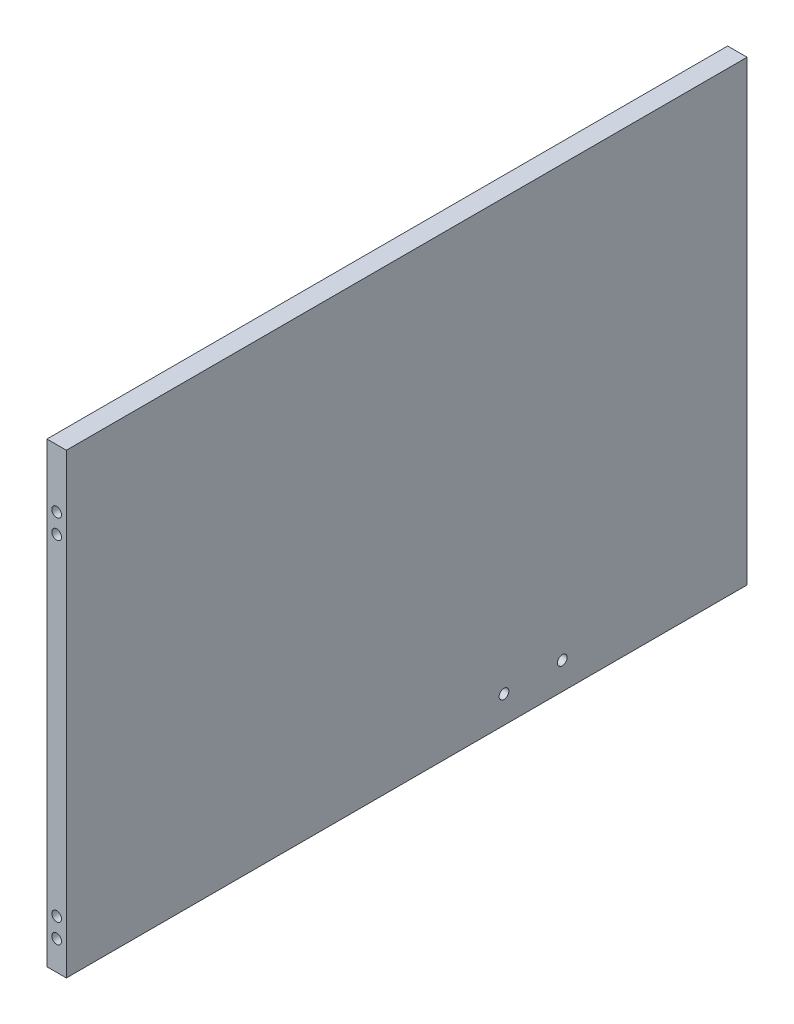
ISO-10303-21;
HEADER;
FILE_DESCRIPTION(('STEP AP214'),'2;1');
FILE_NAME('part.step','',(''),(''),'','','');
FILE_SCHEMA(('AUTOMOTIVE_DESIGN { 1 0 10303 214 1 1 1 1 }'));
ENDSEC;
DATA;
#1=APPLICATION_CONTEXT('core data for automotive mechanical design processes');
#2=APPLICATION_PROTOCOL_DEFINITION('international standard','automotive_design',2000,#1);
#3=PRODUCT_CONTEXT('',#1,'mechanical');
#4=PRODUCT('Part','Part','',(#3));
#5=PRODUCT_RELATED_PRODUCT_CATEGORY('part','',(#4));
#6=PRODUCT_DEFINITION_FORMATION('','',#4);
#7=PRODUCT_DEFINITION_CONTEXT('part definition',#1,'design');
#8=PRODUCT_DEFINITION('design','',#6,#7);
#9=PRODUCT_DEFINITION_SHAPE('','',#8);
#10=(LENGTH_UNIT() NAMED_UNIT(*) SI_UNIT(.MILLI.,.METRE.));
#11=(NAMED_UNIT(*) PLANE_ANGLE_UNIT() SI_UNIT($,.RADIAN.));
#12=(NAMED_UNIT(*) SI_UNIT($,.STERADIAN.) SOLID_ANGLE_UNIT());
#13=UNCERTAINTY_MEASURE_WITH_UNIT(LENGTH_MEASURE(1.E-05),#10,'distance_accuracy_value','');
#14=(GEOMETRIC_REPRESENTATION_CONTEXT(3) GLOBAL_UNCERTAINTY_ASSIGNED_CONTEXT((#13)) GLOBAL_UNIT_ASSIGNED_CONTEXT((#10,
#11,#12)) REPRESENTATION_CONTEXT('',''));
#15=CARTESIAN_POINT('',(0.,0.,0.));
#16=DIRECTION('',(0.,0.,1.));
#17=DIRECTION('',(1.,0.,0.));
#18=AXIS2_PLACEMENT_3D('',#15,#16,#17);
#19=CARTESIAN_POINT('',(10.,117.5,-175.));
#20=DIRECTION('',(0.,0.,1.));
#21=DIRECTION('',(0.,-1.,0.));
#22=AXIS2_PLACEMENT_3D('',#19,#20,#21);
#23=PLANE('',#22);
#24=CARTESIAN_POINT('',(5.,87.5,-175.));
#25=DIRECTION('',(0.,0.,-1.));
#26=DIRECTION('',(0.,1.,0.));
#27=AXIS2_PLACEMENT_3D('',#24,#25,#26);
#28=CIRCLE('',#27,2.5);
#29=CARTESIAN_POINT('',(5.,90.,-175.));
#30=VERTEX_POINT('',#29);
#31=EDGE_CURVE('E144',#30,#30,#28,.T.);
#32=ORIENTED_EDGE('',*,*,#31,.F.);
#33=EDGE_LOOP('',(#32));
#34=FACE_BOUND('',#33,.T.);
#35=CARTESIAN_POINT('',(5.,77.5,-175.));
#36=DIRECTION('',(0.,0.,-1.));
#37=DIRECTION('',(0.,1.,0.));
#38=AXIS2_PLACEMENT_3D('',#35,#36,#37);
#39=CIRCLE('',#38,2.5);
#40=CARTESIAN_POINT('',(5.,80.,-175.));
#41=VERTEX_POINT('',#40);
#42=EDGE_CURVE('E138',#41,#41,#39,.T.);
#43=ORIENTED_EDGE('',*,*,#42,.F.);
#44=EDGE_LOOP('',(#43));
#45=FACE_BOUND('',#44,.T.);
#46=CARTESIAN_POINT('',(5.,-92.5,-175.));
#47=DIRECTION('',(0.,0.,-1.));
#48=DIRECTION('',(0.,1.,0.));
#49=AXIS2_PLACEMENT_3D('',#46,#47,#48);
#50=CIRCLE('',#49,2.5);
#51=CARTESIAN_POINT('',(5.,-90.,-175.));
#52=VERTEX_POINT('',#51);
#53=EDGE_CURVE('E132',#52,#52,#50,.T.);
#54=ORIENTED_EDGE('',*,*,#53,.F.);
#55=EDGE_LOOP('',(#54));
#56=FACE_BOUND('',#55,.T.);
#57=CARTESIAN_POINT('',(5.,-102.5,-175.));
#58=DIRECTION('',(0.,0.,-1.));
#59=DIRECTION('',(0.,1.,0.));
#60=AXIS2_PLACEMENT_3D('',#57,#58,#59);
#61=CIRCLE('',#60,2.5);
#62=CARTESIAN_POINT('',(5.,-100.,-175.));
#63=VERTEX_POINT('',#62);
#64=EDGE_CURVE('E125',#63,#63,#61,.T.);
#65=ORIENTED_EDGE('',*,*,#64,.F.);
#66=EDGE_LOOP('',(#65));
#67=FACE_BOUND('',#66,.T.);
#68=DIRECTION('',(0.,1.,0.));
#69=VECTOR('',#68,1.);
#70=CARTESIAN_POINT('',(0.,117.5,-175.));
#71=LINE('',#70,#69);
#72=CARTESIAN_POINT('',(0.,-117.5,-175.));
#73=VERTEX_POINT('',#72);
#74=CARTESIAN_POINT('',(0.,117.5,-175.));
#75=VERTEX_POINT('',#74);
#76=EDGE_CURVE('E99',#73,#75,#71,.T.);
#77=ORIENTED_EDGE('',*,*,#76,.T.);
#78=DIRECTION('',(-1.,0.,0.));
#79=VECTOR('',#78,1.);
#80=CARTESIAN_POINT('',(10.,117.5,-175.));
#81=LINE('',#80,#79);
#82=CARTESIAN_POINT('',(10.,117.5,-175.));
#83=VERTEX_POINT('',#82);
#84=EDGE_CURVE('E11',#83,#75,#81,.T.);
#85=ORIENTED_EDGE('',*,*,#84,.F.);
#86=DIRECTION('',(0.,1.,0.));
#87=VECTOR('',#86,1.);
#88=CARTESIAN_POINT('',(10.,117.5,-175.));
#89=LINE('',#88,#87);
#90=CARTESIAN_POINT('',(10.,-117.5,-175.));
#91=VERTEX_POINT('',#90);
#92=EDGE_CURVE('E87',#91,#83,#89,.T.);
#93=ORIENTED_EDGE('',*,*,#92,.F.);
#94=DIRECTION('',(-1.,0.,0.));
#95=VECTOR('',#94,1.);
#96=CARTESIAN_POINT('',(10.,-117.5,-175.));
#97=LINE('',#96,#95);
#98=EDGE_CURVE('E95',#91,#73,#97,.T.);
#99=ORIENTED_EDGE('',*,*,#98,.T.);
#100=EDGE_LOOP('',(#77,#85,#93,#99));
#101=FACE_BOUND('',#100,.T.);
#102=ADVANCED_FACE('F36',(#34,#45,#56,#67,#101),#23,.F.);
#103=CARTESIAN_POINT('',(10.,117.5,175.));
#104=DIRECTION('',(0.,-1.,0.));
#105=DIRECTION('',(0.,0.,-1.));
#106=AXIS2_PLACEMENT_3D('',#103,#104,#105);
#107=PLANE('',#106);
#108=DIRECTION('',(0.,0.,1.));
#109=VECTOR('',#108,1.);
#110=CARTESIAN_POINT('',(0.,117.5,175.));
#111=LINE('',#110,#109);
#112=CARTESIAN_POINT('',(0.,117.5,175.));
#113=VERTEX_POINT('',#112);
#114=EDGE_CURVE('E91',#75,#113,#111,.T.);
#115=ORIENTED_EDGE('',*,*,#114,.T.);
#116=DIRECTION('',(-1.,0.,0.));
#117=VECTOR('',#116,1.);
#118=CARTESIAN_POINT('',(10.,117.5,175.));
#119=LINE('',#118,#117);
#120=CARTESIAN_POINT('',(10.,117.5,175.));
#121=VERTEX_POINT('',#120);
#122=EDGE_CURVE('E44',#121,#113,#119,.T.);
#123=ORIENTED_EDGE('',*,*,#122,.F.);
#124=DIRECTION('',(0.,0.,1.));
#125=VECTOR('',#124,1.);
#126=CARTESIAN_POINT('',(10.,117.5,175.));
#127=LINE('',#126,#125);
#128=EDGE_CURVE('E82',#83,#121,#127,.T.);
#129=ORIENTED_EDGE('',*,*,#128,.F.);
#130=ORIENTED_EDGE('',*,*,#84,.T.);
#131=EDGE_LOOP('',(#115,#123,#129,#130));
#132=FACE_BOUND('',#131,.T.);
#133=ADVANCED_FACE('F90',(#132),#107,.F.);
#134=CARTESIAN_POINT('',(10.,117.5,175.));
#135=DIRECTION('',(0.,0.,-1.));
#136=DIRECTION('',(0.,1.,0.));
#137=AXIS2_PLACEMENT_3D('',#134,#135,#136);
#138=PLANE('',#137);
#139=CARTESIAN_POINT('',(5.,87.5,175.));
#140=DIRECTION('',(0.,0.,-1.));
#141=DIRECTION('',(0.,1.,0.));
#142=AXIS2_PLACEMENT_3D('',#139,#140,#141);
#143=CIRCLE('',#142,2.5);
#144=CARTESIAN_POINT('',(5.,90.,175.));
#145=VERTEX_POINT('',#144);
#146=EDGE_CURVE('E167',#145,#145,#143,.T.);
#147=ORIENTED_EDGE('',*,*,#146,.T.);
#148=EDGE_LOOP('',(#147));
#149=FACE_BOUND('',#148,.T.);
#150=CARTESIAN_POINT('',(5.,77.5,175.));
#151=DIRECTION('',(0.,0.,-1.));
#152=DIRECTION('',(0.,1.,0.));
#153=AXIS2_PLACEMENT_3D('',#150,#151,#152);
#154=CIRCLE('',#153,2.5);
#155=CARTESIAN_POINT('',(5.,80.,175.));
#156=VERTEX_POINT('',#155);
#157=EDGE_CURVE('E161',#156,#156,#154,.T.);
#158=ORIENTED_EDGE('',*,*,#157,.T.);
#159=EDGE_LOOP('',(#158));
#160=FACE_BOUND('',#159,.T.);
#161=CARTESIAN_POINT('',(5.,-92.5,175.));
#162=DIRECTION('',(0.,0.,-1.));
#163=DIRECTION('',(0.,1.,0.));
#164=AXIS2_PLACEMENT_3D('',#161,#162,#163);
#165=CIRCLE('',#164,2.5);
#166=CARTESIAN_POINT('',(5.,-90.,175.));
#167=VERTEX_POINT('',#166);
#168=EDGE_CURVE('E155',#167,#167,#165,.T.);
#169=ORIENTED_EDGE('',*,*,#168,.T.);
#170=EDGE_LOOP('',(#169));
#171=FACE_BOUND('',#170,.T.);
#172=CARTESIAN_POINT('',(5.,-102.5,175.));
#173=DIRECTION('',(0.,0.,-1.));
#174=DIRECTION('',(0.,1.,0.));
#175=AXIS2_PLACEMENT_3D('',#172,#173,#174);
#176=CIRCLE('',#175,2.5);
#177=CARTESIAN_POINT('',(5.,-100.,175.));
#178=VERTEX_POINT('',#177);
#179=EDGE_CURVE('E149',#178,#178,#176,.T.);
#180=ORIENTED_EDGE('',*,*,#179,.T.);
#181=EDGE_LOOP('',(#180));
#182=FACE_BOUND('',#181,.T.);
#183=DIRECTION('',(0.,-1.,0.));
#184=VECTOR('',#183,1.);
#185=CARTESIAN_POINT('',(0.,117.5,175.));
#186=LINE('',#185,#184);
#187=CARTESIAN_POINT('',(0.,-117.5,175.));
#188=VERTEX_POINT('',#187);
#189=EDGE_CURVE('E69',#113,#188,#186,.T.);
#190=ORIENTED_EDGE('',*,*,#189,.T.);
#191=DIRECTION('',(-1.,0.,0.));
#192=VECTOR('',#191,1.);
#193=CARTESIAN_POINT('',(10.,-117.5,175.));
#194=LINE('',#193,#192);
#195=CARTESIAN_POINT('',(10.,-117.5,175.));
#196=VERTEX_POINT('',#195);
#197=EDGE_CURVE('E92',#196,#188,#194,.T.);
#198=ORIENTED_EDGE('',*,*,#197,.F.);
#199=DIRECTION('',(0.,-1.,0.));
#200=VECTOR('',#199,1.);
#201=CARTESIAN_POINT('',(10.,117.5,175.));
#202=LINE('',#201,#200);
#203=EDGE_CURVE('E85',#121,#196,#202,.T.);
#204=ORIENTED_EDGE('',*,*,#203,.F.);
#205=ORIENTED_EDGE('',*,*,#122,.T.);
#206=EDGE_LOOP('',(#190,#198,#204,#205));
#207=FACE_BOUND('',#206,.T.);
#208=ADVANCED_FACE('F93',(#149,#160,#171,#182,#207),#138,.F.);
#209=CARTESIAN_POINT('',(10.,-117.5,175.));
#210=DIRECTION('',(0.,1.,0.));
#211=DIRECTION('',(0.,0.,1.));
#212=AXIS2_PLACEMENT_3D('',#209,#210,#211);
#213=PLANE('',#212);
#214=DIRECTION('',(0.,0.,-1.));
#215=VECTOR('',#214,1.);
#216=CARTESIAN_POINT('',(0.,-117.5,175.));
#217=LINE('',#216,#215);
#218=EDGE_CURVE('E75',#188,#73,#217,.T.);
#219=ORIENTED_EDGE('',*,*,#218,.T.);
#220=ORIENTED_EDGE('',*,*,#98,.F.);
#221=DIRECTION('',(0.,0.,-1.));
#222=VECTOR('',#221,1.);
#223=CARTESIAN_POINT('',(10.,-117.5,175.));
#224=LINE('',#223,#222);
#225=EDGE_CURVE('E52',#196,#91,#224,.T.);
#226=ORIENTED_EDGE('',*,*,#225,.F.);
#227=ORIENTED_EDGE('',*,*,#197,.T.);
#228=EDGE_LOOP('',(#219,#220,#226,#227));
#229=FACE_BOUND('',#228,.T.);
#230=ADVANCED_FACE('F107',(#229),#213,.F.);
#231=CARTESIAN_POINT('',(10.,0.,0.));
#232=DIRECTION('',(1.,0.,0.));
#233=DIRECTION('',(0.,0.,-1.));
#234=AXIS2_PLACEMENT_3D('',#231,#232,#233);
#235=PLANE('',#234);
#236=CARTESIAN_POINT('',(10.,-103.5,-50.0000000000001));
#237=DIRECTION('',(1.,0.,0.));
#238=DIRECTION('',(0.,0.,-1.));
#239=AXIS2_PLACEMENT_3D('',#236,#237,#238);
#240=CIRCLE('',#239,2.5);
#241=CARTESIAN_POINT('',(10.,-103.5,-52.5000000000001));
#242=VERTEX_POINT('',#241);
#243=EDGE_CURVE('E120',#242,#242,#240,.T.);
#244=ORIENTED_EDGE('',*,*,#243,.F.);
#245=EDGE_LOOP('',(#244));
#246=FACE_BOUND('',#245,.T.);
#247=CARTESIAN_POINT('',(10.,-103.5,-80.0000000000001));
#248=DIRECTION('',(1.,0.,0.));
#249=DIRECTION('',(0.,0.,-1.));
#250=AXIS2_PLACEMENT_3D('',#247,#248,#249);
#251=CIRCLE('',#250,2.5);
#252=CARTESIAN_POINT('',(10.,-103.5,-82.5000000000001));
#253=VERTEX_POINT('',#252);
#254=EDGE_CURVE('E113',#253,#253,#251,.T.);
#255=ORIENTED_EDGE('',*,*,#254,.F.);
#256=EDGE_LOOP('',(#255));
#257=FACE_BOUND('',#256,.T.);
#258=ORIENTED_EDGE('',*,*,#92,.T.);
#259=ORIENTED_EDGE('',*,*,#128,.T.);
#260=ORIENTED_EDGE('',*,*,#203,.T.);
#261=ORIENTED_EDGE('',*,*,#225,.T.);
#262=EDGE_LOOP('',(#258,#259,#260,#261));
#263=FACE_BOUND('',#262,.T.);
#264=ADVANCED_FACE('F83',(#246,#257,#263),#235,.T.);
#265=CARTESIAN_POINT('',(0.,0.,0.));
#266=DIRECTION('',(1.,0.,0.));
#267=DIRECTION('',(0.,0.,-1.));
#268=AXIS2_PLACEMENT_3D('',#265,#266,#267);
#269=PLANE('',#268);
#270=CARTESIAN_POINT('',(0.,-103.5,-50.0000000000001));
#271=DIRECTION('',(1.,0.,0.));
#272=DIRECTION('',(0.,0.,-1.));
#273=AXIS2_PLACEMENT_3D('',#270,#271,#272);
#274=CIRCLE('',#273,2.5);
#275=CARTESIAN_POINT('',(0.,-103.5,-52.5000000000001));
#276=VERTEX_POINT('',#275);
#277=EDGE_CURVE('E102',#276,#276,#274,.T.);
#278=ORIENTED_EDGE('',*,*,#277,.T.);
#279=EDGE_LOOP('',(#278));
#280=FACE_BOUND('',#279,.T.);
#281=CARTESIAN_POINT('',(0.,-103.5,-80.0000000000001));
#282=DIRECTION('',(1.,0.,0.));
#283=DIRECTION('',(0.,0.,-1.));
#284=AXIS2_PLACEMENT_3D('',#281,#282,#283);
#285=CIRCLE('',#284,2.5);
#286=CARTESIAN_POINT('',(0.,-103.5,-82.5000000000001));
#287=VERTEX_POINT('',#286);
#288=EDGE_CURVE('E116',#287,#287,#285,.T.);
#289=ORIENTED_EDGE('',*,*,#288,.T.);
#290=EDGE_LOOP('',(#289));
#291=FACE_BOUND('',#290,.T.);
#292=ORIENTED_EDGE('',*,*,#76,.F.);
#293=ORIENTED_EDGE('',*,*,#218,.F.);
#294=ORIENTED_EDGE('',*,*,#189,.F.);
#295=ORIENTED_EDGE('',*,*,#114,.F.);
#296=EDGE_LOOP('',(#292,#293,#294,#295));
#297=FACE_BOUND('',#296,.T.);
#298=ADVANCED_FACE('F110',(#280,#291,#297),#269,.F.);
#299=CARTESIAN_POINT('',(0.,-103.5,-80.0000000000001));
#300=DIRECTION('',(1.,0.,0.));
#301=DIRECTION('',(0.,0.,-1.));
#302=AXIS2_PLACEMENT_3D('',#299,#300,#301);
#303=CYLINDRICAL_SURFACE('',#302,2.5);
#304=ORIENTED_EDGE('',*,*,#288,.F.);
#305=EDGE_LOOP('',(#304));
#306=FACE_BOUND('',#305,.T.);
#307=ORIENTED_EDGE('',*,*,#254,.T.);
#308=EDGE_LOOP('',(#307));
#309=FACE_BOUND('',#308,.T.);
#310=ADVANCED_FACE('F210',(#306,#309),#303,.F.);
#311=CARTESIAN_POINT('',(0.,-103.5,-50.0000000000001));
#312=DIRECTION('',(1.,0.,0.));
#313=DIRECTION('',(0.,0.,-1.));
#314=AXIS2_PLACEMENT_3D('',#311,#312,#313);
#315=CYLINDRICAL_SURFACE('',#314,2.5);
#316=ORIENTED_EDGE('',*,*,#277,.F.);
#317=EDGE_LOOP('',(#316));
#318=FACE_BOUND('',#317,.T.);
#319=ORIENTED_EDGE('',*,*,#243,.T.);
#320=EDGE_LOOP('',(#319));
#321=FACE_BOUND('',#320,.T.);
#322=ADVANCED_FACE('F200',(#318,#321),#315,.F.);
#323=CARTESIAN_POINT('',(5.,-102.5,-165.));
#324=DIRECTION('',(0.,0.,-1.));
#325=DIRECTION('',(0.,1.,0.));
#326=AXIS2_PLACEMENT_3D('',#323,#324,#325);
#327=CYLINDRICAL_SURFACE('',#326,2.5);
#328=CARTESIAN_POINT('',(5.,-102.5,-165.));
#329=DIRECTION('',(0.,0.,-1.));
#330=DIRECTION('',(0.,1.,0.));
#331=AXIS2_PLACEMENT_3D('',#328,#329,#330);
#332=CIRCLE('',#331,2.5);
#333=CARTESIAN_POINT('',(5.,-100.,-165.));
#334=VERTEX_POINT('',#333);
#335=EDGE_CURVE('E128',#334,#334,#332,.T.);
#336=ORIENTED_EDGE('',*,*,#335,.F.);
#337=EDGE_LOOP('',(#336));
#338=FACE_BOUND('',#337,.T.);
#339=ORIENTED_EDGE('',*,*,#64,.T.);
#340=EDGE_LOOP('',(#339));
#341=FACE_BOUND('',#340,.T.);
#342=ADVANCED_FACE('F197',(#338,#341),#327,.F.);
#343=CARTESIAN_POINT('',(5.,-102.5,-165.));
#344=DIRECTION('',(0.,0.,-1.));
#345=DIRECTION('',(0.,1.,0.));
#346=AXIS2_PLACEMENT_3D('',#343,#344,#345);
#347=PLANE('',#346);
#348=ORIENTED_EDGE('',*,*,#335,.T.);
#349=EDGE_LOOP('',(#348));
#350=FACE_BOUND('',#349,.T.);
#351=ADVANCED_FACE('F199',(#350),#347,.T.);
#352=CARTESIAN_POINT('',(5.,-92.5,-165.));
#353=DIRECTION('',(0.,0.,-1.));
#354=DIRECTION('',(0.,1.,0.));
#355=AXIS2_PLACEMENT_3D('',#352,#353,#354);
#356=CYLINDRICAL_SURFACE('',#355,2.5);
#357=CARTESIAN_POINT('',(5.,-92.5,-165.));
#358=DIRECTION('',(0.,0.,-1.));
#359=DIRECTION('',(0.,1.,0.));
#360=AXIS2_PLACEMENT_3D('',#357,#358,#359);
#361=CIRCLE('',#360,2.5);
#362=CARTESIAN_POINT('',(5.,-90.,-165.));
#363=VERTEX_POINT('',#362);
#364=EDGE_CURVE('E135',#363,#363,#361,.T.);
#365=ORIENTED_EDGE('',*,*,#364,.F.);
#366=EDGE_LOOP('',(#365));
#367=FACE_BOUND('',#366,.T.);
#368=ORIENTED_EDGE('',*,*,#53,.T.);
#369=EDGE_LOOP('',(#368));
#370=FACE_BOUND('',#369,.T.);
#371=ADVANCED_FACE('F207',(#367,#370),#356,.F.);
#372=CARTESIAN_POINT('',(5.,-92.5,-165.));
#373=DIRECTION('',(0.,0.,-1.));
#374=DIRECTION('',(0.,1.,0.));
#375=AXIS2_PLACEMENT_3D('',#372,#373,#374);
#376=PLANE('',#375);
#377=ORIENTED_EDGE('',*,*,#364,.T.);
#378=EDGE_LOOP('',(#377));
#379=FACE_BOUND('',#378,.T.);
#380=ADVANCED_FACE('F267',(#379),#376,.T.);
#381=CARTESIAN_POINT('',(5.,77.5,-165.));
#382=DIRECTION('',(0.,0.,-1.));
#383=DIRECTION('',(0.,1.,0.));
#384=AXIS2_PLACEMENT_3D('',#381,#382,#383);
#385=CYLINDRICAL_SURFACE('',#384,2.5);
#386=CARTESIAN_POINT('',(5.,77.5,-165.));
#387=DIRECTION('',(0.,0.,-1.));
#388=DIRECTION('',(0.,1.,0.));
#389=AXIS2_PLACEMENT_3D('',#386,#387,#388);
#390=CIRCLE('',#389,2.5);
#391=CARTESIAN_POINT('',(5.,80.,-165.));
#392=VERTEX_POINT('',#391);
#393=EDGE_CURVE('E141',#392,#392,#390,.T.);
#394=ORIENTED_EDGE('',*,*,#393,.F.);
#395=EDGE_LOOP('',(#394));
#396=FACE_BOUND('',#395,.T.);
#397=ORIENTED_EDGE('',*,*,#42,.T.);
#398=EDGE_LOOP('',(#397));
#399=FACE_BOUND('',#398,.T.);
#400=ADVANCED_FACE('F263',(#396,#399),#385,.F.);
#401=CARTESIAN_POINT('',(5.,77.5,-165.));
#402=DIRECTION('',(0.,0.,-1.));
#403=DIRECTION('',(0.,1.,0.));
#404=AXIS2_PLACEMENT_3D('',#401,#402,#403);
#405=PLANE('',#404);
#406=ORIENTED_EDGE('',*,*,#393,.T.);
#407=EDGE_LOOP('',(#406));
#408=FACE_BOUND('',#407,.T.);
#409=ADVANCED_FACE('F259',(#408),#405,.T.);
#410=CARTESIAN_POINT('',(5.,87.5,-165.));
#411=DIRECTION('',(0.,0.,-1.));
#412=DIRECTION('',(0.,1.,0.));
#413=AXIS2_PLACEMENT_3D('',#410,#411,#412);
#414=CYLINDRICAL_SURFACE('',#413,2.5);
#415=CARTESIAN_POINT('',(5.,87.5,-165.));
#416=DIRECTION('',(0.,0.,-1.));
#417=DIRECTION('',(0.,1.,0.));
#418=AXIS2_PLACEMENT_3D('',#415,#416,#417);
#419=CIRCLE('',#418,2.5);
#420=CARTESIAN_POINT('',(5.,90.,-165.));
#421=VERTEX_POINT('',#420);
#422=EDGE_CURVE('E117',#421,#421,#419,.T.);
#423=ORIENTED_EDGE('',*,*,#422,.F.);
#424=EDGE_LOOP('',(#423));
#425=FACE_BOUND('',#424,.T.);
#426=ORIENTED_EDGE('',*,*,#31,.T.);
#427=EDGE_LOOP('',(#426));
#428=FACE_BOUND('',#427,.T.);
#429=ADVANCED_FACE('F252',(#425,#428),#414,.F.);
#430=CARTESIAN_POINT('',(5.,87.5,-165.));
#431=DIRECTION('',(0.,0.,-1.));
#432=DIRECTION('',(0.,1.,0.));
#433=AXIS2_PLACEMENT_3D('',#430,#431,#432);
#434=PLANE('',#433);
#435=ORIENTED_EDGE('',*,*,#422,.T.);
#436=EDGE_LOOP('',(#435));
#437=FACE_BOUND('',#436,.T.);
#438=ADVANCED_FACE('F242',(#437),#434,.T.);
#439=CARTESIAN_POINT('',(5.,-102.5,165.));
#440=DIRECTION('',(0.,0.,1.));
#441=DIRECTION('',(0.,-1.,0.));
#442=AXIS2_PLACEMENT_3D('',#439,#440,#441);
#443=CYLINDRICAL_SURFACE('',#442,2.5);
#444=CARTESIAN_POINT('',(5.,-102.5,165.));
#445=DIRECTION('',(0.,0.,-1.));
#446=DIRECTION('',(0.,1.,0.));
#447=AXIS2_PLACEMENT_3D('',#444,#445,#446);
#448=CIRCLE('',#447,2.5);
#449=CARTESIAN_POINT('',(5.,-100.,165.));
#450=VERTEX_POINT('',#449);
#451=EDGE_CURVE('E152',#450,#450,#448,.T.);
#452=ORIENTED_EDGE('',*,*,#451,.T.);
#453=EDGE_LOOP('',(#452));
#454=FACE_BOUND('',#453,.T.);
#455=ORIENTED_EDGE('',*,*,#179,.F.);
#456=EDGE_LOOP('',(#455));
#457=FACE_BOUND('',#456,.T.);
#458=ADVANCED_FACE('F239',(#454,#457),#443,.F.);
#459=CARTESIAN_POINT('',(5.,-102.5,165.));
#460=DIRECTION('',(0.,0.,1.));
#461=DIRECTION('',(0.,1.,0.));
#462=AXIS2_PLACEMENT_3D('',#459,#460,#461);
#463=PLANE('',#462);
#464=ORIENTED_EDGE('',*,*,#451,.F.);
#465=EDGE_LOOP('',(#464));
#466=FACE_BOUND('',#465,.T.);
#467=ADVANCED_FACE('F241',(#466),#463,.T.);
#468=CARTESIAN_POINT('',(5.,-92.5,165.));
#469=DIRECTION('',(0.,0.,1.));
#470=DIRECTION('',(0.,-1.,0.));
#471=AXIS2_PLACEMENT_3D('',#468,#469,#470);
#472=CYLINDRICAL_SURFACE('',#471,2.5);
#473=CARTESIAN_POINT('',(5.,-92.5,165.));
#474=DIRECTION('',(0.,0.,-1.));
#475=DIRECTION('',(0.,1.,0.));
#476=AXIS2_PLACEMENT_3D('',#473,#474,#475);
#477=CIRCLE('',#476,2.5);
#478=CARTESIAN_POINT('',(5.,-90.,165.));
#479=VERTEX_POINT('',#478);
#480=EDGE_CURVE('E158',#479,#479,#477,.T.);
#481=ORIENTED_EDGE('',*,*,#480,.T.);
#482=EDGE_LOOP('',(#481));
#483=FACE_BOUND('',#482,.T.);
#484=ORIENTED_EDGE('',*,*,#168,.F.);
#485=EDGE_LOOP('',(#484));
#486=FACE_BOUND('',#485,.T.);
#487=ADVANCED_FACE('F249',(#483,#486),#472,.F.);
#488=CARTESIAN_POINT('',(5.,-92.5,165.));
#489=DIRECTION('',(0.,0.,1.));
#490=DIRECTION('',(0.,1.,0.));
#491=AXIS2_PLACEMENT_3D('',#488,#489,#490);
#492=PLANE('',#491);
#493=ORIENTED_EDGE('',*,*,#480,.F.);
#494=EDGE_LOOP('',(#493));
#495=FACE_BOUND('',#494,.T.);
#496=ADVANCED_FACE('F324',(#495),#492,.T.);
#497=CARTESIAN_POINT('',(5.,77.5,165.));
#498=DIRECTION('',(0.,0.,1.));
#499=DIRECTION('',(0.,-1.,0.));
#500=AXIS2_PLACEMENT_3D('',#497,#498,#499);
#501=CYLINDRICAL_SURFACE('',#500,2.5);
#502=CARTESIAN_POINT('',(5.,77.5,165.));
#503=DIRECTION('',(0.,0.,-1.));
#504=DIRECTION('',(0.,1.,0.));
#505=AXIS2_PLACEMENT_3D('',#502,#503,#504);
#506=CIRCLE('',#505,2.5);
#507=CARTESIAN_POINT('',(5.,80.,165.));
#508=VERTEX_POINT('',#507);
#509=EDGE_CURVE('E164',#508,#508,#506,.T.);
#510=ORIENTED_EDGE('',*,*,#509,.T.);
#511=EDGE_LOOP('',(#510));
#512=FACE_BOUND('',#511,.T.);
#513=ORIENTED_EDGE('',*,*,#157,.F.);
#514=EDGE_LOOP('',(#513));
#515=FACE_BOUND('',#514,.T.);
#516=ADVANCED_FACE('F333',(#512,#515),#501,.F.);
#517=CARTESIAN_POINT('',(5.,77.5,165.));
#518=DIRECTION('',(0.,0.,1.));
#519=DIRECTION('',(0.,1.,0.));
#520=AXIS2_PLACEMENT_3D('',#517,#518,#519);
#521=PLANE('',#520);
#522=ORIENTED_EDGE('',*,*,#509,.F.);
#523=EDGE_LOOP('',(#522));
#524=FACE_BOUND('',#523,.T.);
#525=ADVANCED_FACE('F182',(#524),#521,.T.);
#526=CARTESIAN_POINT('',(5.,87.5,165.));
#527=DIRECTION('',(0.,0.,1.));
#528=DIRECTION('',(0.,-1.,0.));
#529=AXIS2_PLACEMENT_3D('',#526,#527,#528);
#530=CYLINDRICAL_SURFACE('',#529,2.5);
#531=CARTESIAN_POINT('',(5.,87.5,165.));
#532=DIRECTION('',(0.,0.,-1.));
#533=DIRECTION('',(0.,1.,0.));
#534=AXIS2_PLACEMENT_3D('',#531,#532,#533);
#535=CIRCLE('',#534,2.5);
#536=CARTESIAN_POINT('',(5.,90.,165.));
#537=VERTEX_POINT('',#536);
#538=EDGE_CURVE('E129',#537,#537,#535,.T.);
#539=ORIENTED_EDGE('',*,*,#538,.T.);
#540=EDGE_LOOP('',(#539));
#541=FACE_BOUND('',#540,.T.);
#542=ORIENTED_EDGE('',*,*,#146,.F.);
#543=EDGE_LOOP('',(#542));
#544=FACE_BOUND('',#543,.T.);
#545=ADVANCED_FACE('F173',(#541,#544),#530,.F.);
#546=CARTESIAN_POINT('',(5.,87.5,165.));
#547=DIRECTION('',(0.,0.,1.));
#548=DIRECTION('',(0.,1.,0.));
#549=AXIS2_PLACEMENT_3D('',#546,#547,#548);
#550=PLANE('',#549);
#551=ORIENTED_EDGE('',*,*,#538,.F.);
#552=EDGE_LOOP('',(#551));
#553=FACE_BOUND('',#552,.T.);
#554=ADVANCED_FACE('F176',(#553),#550,.T.);
#555=CLOSED_SHELL('',(#102,#133,#208,#230,#264,#298,#310,#322,#342,#351,#371,#380,#400,#409,
#429,#438,#458,#467,#487,#496,#516,#525,#545,#554));
#556=MANIFOLD_SOLID_BREP('B2',#555);
#557=ADVANCED_BREP_SHAPE_REPRESENTATION('',(#18,#556),#14);
#558=SHAPE_DEFINITION_REPRESENTATION(#9,#557);
ENDSEC;
END-ISO-10303-21;
